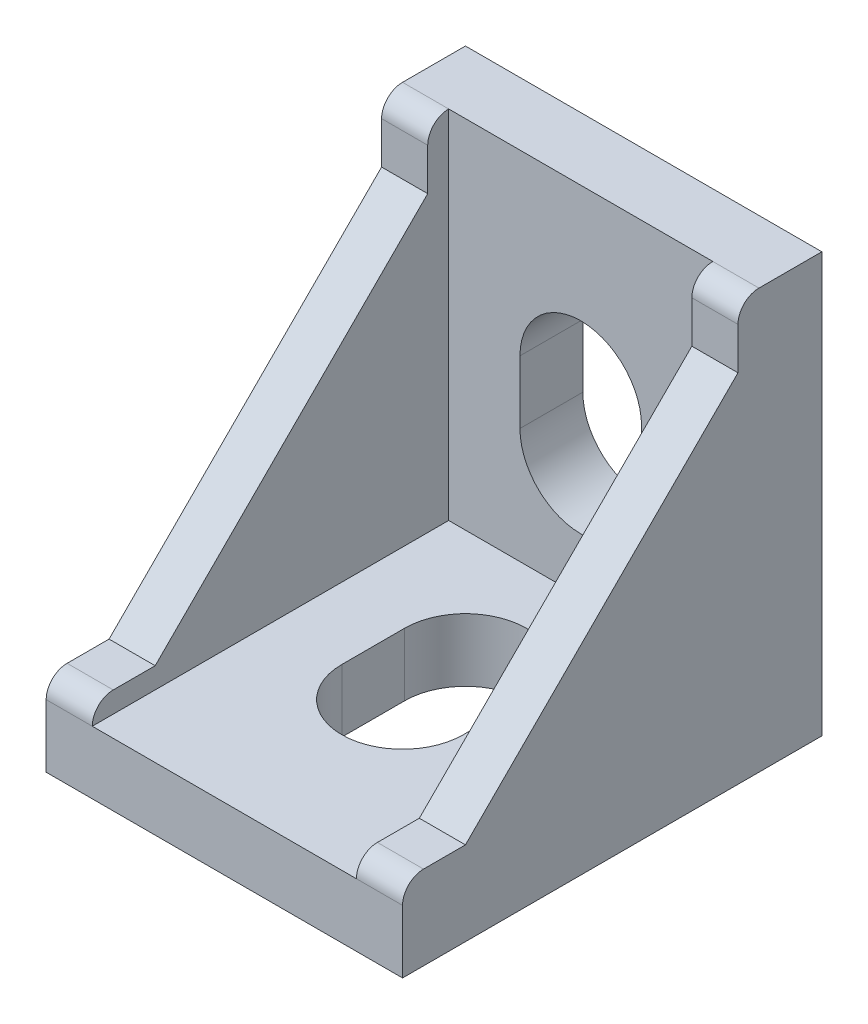
ISO-10303-21;
HEADER;
FILE_DESCRIPTION(('STEP AP214'),'2;1');
FILE_NAME('part.step','',(''),(''),'','','');
FILE_SCHEMA(('AUTOMOTIVE_DESIGN { 1 0 10303 214 1 1 1 1 }'));
ENDSEC;
DATA;
#1=APPLICATION_CONTEXT('core data for automotive mechanical design processes');
#2=APPLICATION_PROTOCOL_DEFINITION('international standard','automotive_design',2000,#1);
#3=PRODUCT_CONTEXT('',#1,'mechanical');
#4=PRODUCT('Part','Part','',(#3));
#5=PRODUCT_RELATED_PRODUCT_CATEGORY('part','',(#4));
#6=PRODUCT_DEFINITION_FORMATION('','',#4);
#7=PRODUCT_DEFINITION_CONTEXT('part definition',#1,'design');
#8=PRODUCT_DEFINITION('design','',#6,#7);
#9=PRODUCT_DEFINITION_SHAPE('','',#8);
#10=(LENGTH_UNIT() NAMED_UNIT(*) SI_UNIT(.MILLI.,.METRE.));
#11=(NAMED_UNIT(*) PLANE_ANGLE_UNIT() SI_UNIT($,.RADIAN.));
#12=(NAMED_UNIT(*) SI_UNIT($,.STERADIAN.) SOLID_ANGLE_UNIT());
#13=UNCERTAINTY_MEASURE_WITH_UNIT(LENGTH_MEASURE(1.E-05),#10,'distance_accuracy_value','');
#14=(GEOMETRIC_REPRESENTATION_CONTEXT(3) GLOBAL_UNCERTAINTY_ASSIGNED_CONTEXT((#13)) GLOBAL_UNIT_ASSIGNED_CONTEXT((#10,
#11,#12)) REPRESENTATION_CONTEXT('',''));
#15=CARTESIAN_POINT('',(0.,0.,0.));
#16=DIRECTION('',(0.,0.,1.));
#17=DIRECTION('',(1.,0.,0.));
#18=AXIS2_PLACEMENT_3D('',#15,#16,#17);
#19=CARTESIAN_POINT('',(0.,20.,0.));
#20=DIRECTION('',(0.,-1.,0.));
#21=DIRECTION('',(0.,0.,-1.));
#22=AXIS2_PLACEMENT_3D('',#19,#20,#21);
#23=PLANE('',#22);
#24=DIRECTION('',(1.,0.,0.));
#25=VECTOR('',#24,1.);
#26=CARTESIAN_POINT('',(-8.5,20.,-7.00000000000001));
#27=LINE('',#26,#25);
#28=CARTESIAN_POINT('',(6.3,20.,-7.00000000000001));
#29=VERTEX_POINT('',#28);
#30=CARTESIAN_POINT('',(8.5,20.,-7.00000000000001));
#31=VERTEX_POINT('',#30);
#32=EDGE_CURVE('E280',#29,#31,#27,.T.);
#33=ORIENTED_EDGE('',*,*,#32,.T.);
#34=DIRECTION('',(0.,0.,-1.));
#35=VECTOR('',#34,1.);
#36=CARTESIAN_POINT('',(8.5,20.,10.));
#37=LINE('',#36,#35);
#38=CARTESIAN_POINT('',(8.5,20.,-10.));
#39=VERTEX_POINT('',#38);
#40=EDGE_CURVE('E355',#31,#39,#37,.T.);
#41=ORIENTED_EDGE('',*,*,#40,.T.);
#42=DIRECTION('',(-1.,0.,0.));
#43=VECTOR('',#42,1.);
#44=CARTESIAN_POINT('',(-8.5,20.,-10.));
#45=LINE('',#44,#43);
#46=CARTESIAN_POINT('',(-8.5,20.,-10.));
#47=VERTEX_POINT('',#46);
#48=EDGE_CURVE('E357',#39,#47,#45,.T.);
#49=ORIENTED_EDGE('',*,*,#48,.T.);
#50=DIRECTION('',(0.,0.,1.));
#51=VECTOR('',#50,1.);
#52=CARTESIAN_POINT('',(-8.5,20.,10.));
#53=LINE('',#52,#51);
#54=CARTESIAN_POINT('',(-8.5,20.,-7.00000000000001));
#55=VERTEX_POINT('',#54);
#56=EDGE_CURVE('E360',#47,#55,#53,.T.);
#57=ORIENTED_EDGE('',*,*,#56,.T.);
#58=CARTESIAN_POINT('',(-6.3,20.,-7.00000000000001));
#59=VERTEX_POINT('',#58);
#60=EDGE_CURVE('E313',#55,#59,#27,.T.);
#61=ORIENTED_EDGE('',*,*,#60,.T.);
#62=DIRECTION('',(-1.,0.,0.));
#63=VECTOR('',#62,1.);
#64=CARTESIAN_POINT('',(6.3,20.,-7.));
#65=LINE('',#64,#63);
#66=EDGE_CURVE('E333',#29,#59,#65,.T.);
#67=ORIENTED_EDGE('',*,*,#66,.F.);
#68=EDGE_LOOP('',(#33,#41,#49,#57,#61,#67));
#69=FACE_BOUND('',#68,.T.);
#70=ADVANCED_FACE('F34',(#69),#23,.F.);
#71=CARTESIAN_POINT('',(8.5,20.,10.));
#72=DIRECTION('',(-1.,0.,0.));
#73=DIRECTION('',(0.,0.,1.));
#74=AXIS2_PLACEMENT_3D('',#71,#72,#73);
#75=PLANE('',#74);
#76=ORIENTED_EDGE('',*,*,#40,.F.);
#77=CARTESIAN_POINT('',(8.5,19.,-7.));
#78=DIRECTION('',(-1.,0.,0.));
#79=DIRECTION('',(0.,0.,-1.));
#80=AXIS2_PLACEMENT_3D('',#77,#78,#79);
#81=CIRCLE('',#80,1.);
#82=CARTESIAN_POINT('',(8.5,19.,-6.));
#83=VERTEX_POINT('',#82);
#84=EDGE_CURVE('E257',#83,#31,#81,.T.);
#85=ORIENTED_EDGE('',*,*,#84,.F.);
#86=DIRECTION('',(0.,1.,0.));
#87=VECTOR('',#86,1.);
#88=CARTESIAN_POINT('',(8.5,19.,-6.));
#89=LINE('',#88,#87);
#90=CARTESIAN_POINT('',(8.5,17.,-6.));
#91=VERTEX_POINT('',#90);
#92=EDGE_CURVE('E268',#91,#83,#89,.T.);
#93=ORIENTED_EDGE('',*,*,#92,.F.);
#94=DIRECTION('',(0.,0.707106781186548,-0.707106781186548));
#95=VECTOR('',#94,1.);
#96=CARTESIAN_POINT('',(8.5,4.,7.));
#97=LINE('',#96,#95);
#98=CARTESIAN_POINT('',(8.5,4.,7.));
#99=VERTEX_POINT('',#98);
#100=EDGE_CURVE('E288',#99,#91,#97,.T.);
#101=ORIENTED_EDGE('',*,*,#100,.F.);
#102=DIRECTION('',(0.,0.,-1.));
#103=VECTOR('',#102,1.);
#104=CARTESIAN_POINT('',(8.5,4.,8.99999999999999));
#105=LINE('',#104,#103);
#106=CARTESIAN_POINT('',(8.5,4.,8.99999999999999));
#107=VERTEX_POINT('',#106);
#108=EDGE_CURVE('E285',#107,#99,#105,.T.);
#109=ORIENTED_EDGE('',*,*,#108,.F.);
#110=CARTESIAN_POINT('',(8.5,3.,9.));
#111=DIRECTION('',(-1.,0.,0.));
#112=DIRECTION('',(0.,0.,1.));
#113=AXIS2_PLACEMENT_3D('',#110,#111,#112);
#114=CIRCLE('',#113,1.);
#115=CARTESIAN_POINT('',(8.5,2.99999999999999,10.));
#116=VERTEX_POINT('',#115);
#117=EDGE_CURVE('E282',#116,#107,#114,.T.);
#118=ORIENTED_EDGE('',*,*,#117,.F.);
#119=DIRECTION('',(0.,-1.,0.));
#120=VECTOR('',#119,1.);
#121=CARTESIAN_POINT('',(8.5,20.,10.));
#122=LINE('',#121,#120);
#123=CARTESIAN_POINT('',(8.5,0.,10.));
#124=VERTEX_POINT('',#123);
#125=EDGE_CURVE('E363',#116,#124,#122,.T.);
#126=ORIENTED_EDGE('',*,*,#125,.T.);
#127=DIRECTION('',(0.,0.,-1.));
#128=VECTOR('',#127,1.);
#129=CARTESIAN_POINT('',(8.5,0.,10.));
#130=LINE('',#129,#128);
#131=CARTESIAN_POINT('',(8.5,0.,-10.));
#132=VERTEX_POINT('',#131);
#133=EDGE_CURVE('E352',#124,#132,#130,.T.);
#134=ORIENTED_EDGE('',*,*,#133,.T.);
#135=DIRECTION('',(0.,-1.,0.));
#136=VECTOR('',#135,1.);
#137=CARTESIAN_POINT('',(8.5,20.,-10.));
#138=LINE('',#137,#136);
#139=EDGE_CURVE('E379',#39,#132,#138,.T.);
#140=ORIENTED_EDGE('',*,*,#139,.F.);
#141=EDGE_LOOP('',(#76,#85,#93,#101,#109,#118,#126,#134,#140));
#142=FACE_BOUND('',#141,.T.);
#143=ADVANCED_FACE('F36',(#142),#75,.F.);
#144=CARTESIAN_POINT('',(-8.5,20.,-10.));
#145=DIRECTION('',(0.,0.,1.));
#146=DIRECTION('',(1.,0.,0.));
#147=AXIS2_PLACEMENT_3D('',#144,#145,#146);
#148=PLANE('',#147);
#149=DIRECTION('',(0.,1.,0.));
#150=VECTOR('',#149,1.);
#151=CARTESIAN_POINT('',(2.9,11.5,-10.));
#152=LINE('',#151,#150);
#153=CARTESIAN_POINT('',(2.9,8.5,-10.));
#154=VERTEX_POINT('',#153);
#155=CARTESIAN_POINT('',(2.9,11.5,-10.));
#156=VERTEX_POINT('',#155);
#157=EDGE_CURVE('E242',#154,#156,#152,.T.);
#158=ORIENTED_EDGE('',*,*,#157,.T.);
#159=CARTESIAN_POINT('',(0.,11.5,-10.));
#160=DIRECTION('',(0.,0.,1.));
#161=DIRECTION('',(1.,0.,0.));
#162=AXIS2_PLACEMENT_3D('',#159,#160,#161);
#163=CIRCLE('',#162,2.9);
#164=CARTESIAN_POINT('',(-2.9,11.5,-10.));
#165=VERTEX_POINT('',#164);
#166=EDGE_CURVE('E232',#156,#165,#163,.T.);
#167=ORIENTED_EDGE('',*,*,#166,.T.);
#168=DIRECTION('',(0.,-1.,0.));
#169=VECTOR('',#168,1.);
#170=CARTESIAN_POINT('',(-2.9,8.5,-10.));
#171=LINE('',#170,#169);
#172=CARTESIAN_POINT('',(-2.9,8.5,-10.));
#173=VERTEX_POINT('',#172);
#174=EDGE_CURVE('E235',#165,#173,#171,.T.);
#175=ORIENTED_EDGE('',*,*,#174,.T.);
#176=CARTESIAN_POINT('',(0.,8.5,-10.));
#177=DIRECTION('',(0.,0.,1.));
#178=DIRECTION('',(1.,0.,0.));
#179=AXIS2_PLACEMENT_3D('',#176,#177,#178);
#180=CIRCLE('',#179,2.9);
#181=EDGE_CURVE('E239',#173,#154,#180,.T.);
#182=ORIENTED_EDGE('',*,*,#181,.T.);
#183=EDGE_LOOP('',(#158,#167,#175,#182));
#184=FACE_BOUND('',#183,.T.);
#185=DIRECTION('',(-1.,0.,0.));
#186=VECTOR('',#185,1.);
#187=CARTESIAN_POINT('',(-8.5,0.,-10.));
#188=LINE('',#187,#186);
#189=CARTESIAN_POINT('',(-8.5,0.,-10.));
#190=VERTEX_POINT('',#189);
#191=EDGE_CURVE('E366',#132,#190,#188,.T.);
#192=ORIENTED_EDGE('',*,*,#191,.T.);
#193=DIRECTION('',(0.,-1.,0.));
#194=VECTOR('',#193,1.);
#195=CARTESIAN_POINT('',(-8.5,20.,-10.));
#196=LINE('',#195,#194);
#197=EDGE_CURVE('E376',#47,#190,#196,.T.);
#198=ORIENTED_EDGE('',*,*,#197,.F.);
#199=ORIENTED_EDGE('',*,*,#48,.F.);
#200=ORIENTED_EDGE('',*,*,#139,.T.);
#201=EDGE_LOOP('',(#192,#198,#199,#200));
#202=FACE_BOUND('',#201,.T.);
#203=ADVANCED_FACE('F448',(#184,#202),#148,.F.);
#204=CARTESIAN_POINT('',(-8.5,20.,10.));
#205=DIRECTION('',(1.,0.,0.));
#206=DIRECTION('',(0.,0.,-1.));
#207=AXIS2_PLACEMENT_3D('',#204,#205,#206);
#208=PLANE('',#207);
#209=DIRECTION('',(0.,1.,0.));
#210=VECTOR('',#209,1.);
#211=CARTESIAN_POINT('',(-8.5,19.,-6.));
#212=LINE('',#211,#210);
#213=CARTESIAN_POINT('',(-8.5,17.,-6.));
#214=VERTEX_POINT('',#213);
#215=CARTESIAN_POINT('',(-8.5,19.,-6.));
#216=VERTEX_POINT('',#215);
#217=EDGE_CURVE('E277',#214,#216,#212,.T.);
#218=ORIENTED_EDGE('',*,*,#217,.T.);
#219=CARTESIAN_POINT('',(-8.5,19.,-7.));
#220=DIRECTION('',(-1.,0.,0.));
#221=DIRECTION('',(0.,0.,-1.));
#222=AXIS2_PLACEMENT_3D('',#219,#220,#221);
#223=CIRCLE('',#222,1.);
#224=EDGE_CURVE('E264',#216,#55,#223,.T.);
#225=ORIENTED_EDGE('',*,*,#224,.T.);
#226=ORIENTED_EDGE('',*,*,#56,.F.);
#227=ORIENTED_EDGE('',*,*,#197,.T.);
#228=DIRECTION('',(0.,0.,1.));
#229=VECTOR('',#228,1.);
#230=CARTESIAN_POINT('',(-8.5,0.,10.));
#231=LINE('',#230,#229);
#232=CARTESIAN_POINT('',(-8.5,0.,10.));
#233=VERTEX_POINT('',#232);
#234=EDGE_CURVE('E368',#190,#233,#231,.T.);
#235=ORIENTED_EDGE('',*,*,#234,.T.);
#236=DIRECTION('',(0.,-1.,0.));
#237=VECTOR('',#236,1.);
#238=CARTESIAN_POINT('',(-8.5,20.,10.));
#239=LINE('',#238,#237);
#240=CARTESIAN_POINT('',(-8.5,2.99999999999999,10.));
#241=VERTEX_POINT('',#240);
#242=EDGE_CURVE('E374',#241,#233,#239,.T.);
#243=ORIENTED_EDGE('',*,*,#242,.F.);
#244=CARTESIAN_POINT('',(-8.5,3.,9.));
#245=DIRECTION('',(-1.,0.,0.));
#246=DIRECTION('',(0.,0.,1.));
#247=AXIS2_PLACEMENT_3D('',#244,#245,#246);
#248=CIRCLE('',#247,1.);
#249=CARTESIAN_POINT('',(-8.5,4.,8.99999999999999));
#250=VERTEX_POINT('',#249);
#251=EDGE_CURVE('E267',#241,#250,#248,.T.);
#252=ORIENTED_EDGE('',*,*,#251,.T.);
#253=DIRECTION('',(0.,0.,-1.));
#254=VECTOR('',#253,1.);
#255=CARTESIAN_POINT('',(-8.5,4.,8.99999999999999));
#256=LINE('',#255,#254);
#257=CARTESIAN_POINT('',(-8.5,4.,7.));
#258=VERTEX_POINT('',#257);
#259=EDGE_CURVE('E271',#250,#258,#256,.T.);
#260=ORIENTED_EDGE('',*,*,#259,.T.);
#261=DIRECTION('',(0.,0.707106781186548,-0.707106781186548));
#262=VECTOR('',#261,1.);
#263=CARTESIAN_POINT('',(-8.5,4.,7.));
#264=LINE('',#263,#262);
#265=EDGE_CURVE('E274',#258,#214,#264,.T.);
#266=ORIENTED_EDGE('',*,*,#265,.T.);
#267=EDGE_LOOP('',(#218,#225,#226,#227,#235,#243,#252,#260,#266));
#268=FACE_BOUND('',#267,.T.);
#269=ADVANCED_FACE('F457',(#268),#208,.F.);
#270=CARTESIAN_POINT('',(-8.5,20.,10.));
#271=DIRECTION('',(0.,0.,-1.));
#272=DIRECTION('',(-1.,0.,0.));
#273=AXIS2_PLACEMENT_3D('',#270,#271,#272);
#274=PLANE('',#273);
#275=ORIENTED_EDGE('',*,*,#125,.F.);
#276=DIRECTION('',(1.,0.,0.));
#277=VECTOR('',#276,1.);
#278=CARTESIAN_POINT('',(-8.5,2.99999999999999,10.));
#279=LINE('',#278,#277);
#280=CARTESIAN_POINT('',(6.3,2.99999999999999,10.));
#281=VERTEX_POINT('',#280);
#282=EDGE_CURVE('E312',#281,#116,#279,.T.);
#283=ORIENTED_EDGE('',*,*,#282,.F.);
#284=DIRECTION('',(1.,0.,0.));
#285=VECTOR('',#284,1.);
#286=CARTESIAN_POINT('',(-6.3,3.,10.));
#287=LINE('',#286,#285);
#288=CARTESIAN_POINT('',(-6.3,3.,10.));
#289=VERTEX_POINT('',#288);
#290=EDGE_CURVE('E337',#289,#281,#287,.T.);
#291=ORIENTED_EDGE('',*,*,#290,.F.);
#292=EDGE_CURVE('E310',#241,#289,#279,.T.);
#293=ORIENTED_EDGE('',*,*,#292,.F.);
#294=ORIENTED_EDGE('',*,*,#242,.T.);
#295=DIRECTION('',(1.,0.,0.));
#296=VECTOR('',#295,1.);
#297=CARTESIAN_POINT('',(-8.5,0.,10.));
#298=LINE('',#297,#296);
#299=EDGE_CURVE('E358',#233,#124,#298,.T.);
#300=ORIENTED_EDGE('',*,*,#299,.T.);
#301=EDGE_LOOP('',(#275,#283,#291,#293,#294,#300));
#302=FACE_BOUND('',#301,.T.);
#303=ADVANCED_FACE('F422',(#302),#274,.F.);
#304=CARTESIAN_POINT('',(0.,0.,0.));
#305=DIRECTION('',(0.,-1.,0.));
#306=DIRECTION('',(0.,0.,-1.));
#307=AXIS2_PLACEMENT_3D('',#304,#305,#306);
#308=PLANE('',#307);
#309=CARTESIAN_POINT('',(0.,0.,-1.5));
#310=DIRECTION('',(0.,1.,0.));
#311=DIRECTION('',(0.,0.,1.));
#312=AXIS2_PLACEMENT_3D('',#309,#310,#311);
#313=CIRCLE('',#312,2.9);
#314=CARTESIAN_POINT('',(2.9,0.,-1.5));
#315=VERTEX_POINT('',#314);
#316=CARTESIAN_POINT('',(-2.9,0.,-1.5));
#317=VERTEX_POINT('',#316);
#318=EDGE_CURVE('E197',#315,#317,#313,.T.);
#319=ORIENTED_EDGE('',*,*,#318,.T.);
#320=DIRECTION('',(0.,0.,1.));
#321=VECTOR('',#320,1.);
#322=CARTESIAN_POINT('',(-2.9,0.,1.5));
#323=LINE('',#322,#321);
#324=CARTESIAN_POINT('',(-2.9,0.,1.5));
#325=VERTEX_POINT('',#324);
#326=EDGE_CURVE('E206',#317,#325,#323,.T.);
#327=ORIENTED_EDGE('',*,*,#326,.T.);
#328=CARTESIAN_POINT('',(0.,0.,1.5));
#329=DIRECTION('',(0.,1.,0.));
#330=DIRECTION('',(0.,0.,1.));
#331=AXIS2_PLACEMENT_3D('',#328,#329,#330);
#332=CIRCLE('',#331,2.9);
#333=CARTESIAN_POINT('',(2.9,0.,1.5));
#334=VERTEX_POINT('',#333);
#335=EDGE_CURVE('E49',#325,#334,#332,.T.);
#336=ORIENTED_EDGE('',*,*,#335,.T.);
#337=DIRECTION('',(0.,0.,-1.));
#338=VECTOR('',#337,1.);
#339=CARTESIAN_POINT('',(2.9,0.,-1.5));
#340=LINE('',#339,#338);
#341=EDGE_CURVE('E203',#334,#315,#340,.T.);
#342=ORIENTED_EDGE('',*,*,#341,.T.);
#343=EDGE_LOOP('',(#319,#327,#336,#342));
#344=FACE_BOUND('',#343,.T.);
#345=ORIENTED_EDGE('',*,*,#133,.F.);
#346=ORIENTED_EDGE('',*,*,#299,.F.);
#347=ORIENTED_EDGE('',*,*,#234,.F.);
#348=ORIENTED_EDGE('',*,*,#191,.F.);
#349=EDGE_LOOP('',(#345,#346,#347,#348));
#350=FACE_BOUND('',#349,.T.);
#351=ADVANCED_FACE('F210',(#344,#350),#308,.T.);
#352=CARTESIAN_POINT('',(-6.3,3.,-7.));
#353=DIRECTION('',(-1.,0.,0.));
#354=DIRECTION('',(0.,0.,1.));
#355=AXIS2_PLACEMENT_3D('',#352,#353,#354);
#356=PLANE('',#355);
#357=DIRECTION('',(0.,1.,0.));
#358=VECTOR('',#357,1.);
#359=CARTESIAN_POINT('',(-6.3,3.,-7.));
#360=LINE('',#359,#358);
#361=CARTESIAN_POINT('',(-6.3,3.,-7.));
#362=VERTEX_POINT('',#361);
#363=EDGE_CURVE('E349',#362,#59,#360,.T.);
#364=ORIENTED_EDGE('',*,*,#363,.T.);
#365=CARTESIAN_POINT('',(-6.3,19.,-7.));
#366=DIRECTION('',(-1.,0.,0.));
#367=DIRECTION('',(0.,0.,1.));
#368=AXIS2_PLACEMENT_3D('',#365,#366,#367);
#369=CIRCLE('',#368,1.);
#370=CARTESIAN_POINT('',(-6.3,19.,-6.));
#371=VERTEX_POINT('',#370);
#372=EDGE_CURVE('E330',#59,#371,#369,.F.);
#373=ORIENTED_EDGE('',*,*,#372,.T.);
#374=DIRECTION('',(0.,-1.,0.));
#375=VECTOR('',#374,1.);
#376=CARTESIAN_POINT('',(-6.3,3.,-6.));
#377=LINE('',#376,#375);
#378=CARTESIAN_POINT('',(-6.3,17.,-6.));
#379=VERTEX_POINT('',#378);
#380=EDGE_CURVE('E327',#371,#379,#377,.T.);
#381=ORIENTED_EDGE('',*,*,#380,.T.);
#382=DIRECTION('',(0.,-0.707106781186548,0.707106781186548));
#383=VECTOR('',#382,1.);
#384=CARTESIAN_POINT('',(-6.3,10.5,0.5));
#385=LINE('',#384,#383);
#386=CARTESIAN_POINT('',(-6.3,4.,7.));
#387=VERTEX_POINT('',#386);
#388=EDGE_CURVE('E324',#379,#387,#385,.T.);
#389=ORIENTED_EDGE('',*,*,#388,.T.);
#390=DIRECTION('',(0.,0.,1.));
#391=VECTOR('',#390,1.);
#392=CARTESIAN_POINT('',(-6.3,4.,-7.));
#393=LINE('',#392,#391);
#394=CARTESIAN_POINT('',(-6.3,4.,8.99999999999999));
#395=VERTEX_POINT('',#394);
#396=EDGE_CURVE('E321',#387,#395,#393,.T.);
#397=ORIENTED_EDGE('',*,*,#396,.T.);
#398=CARTESIAN_POINT('',(-6.3,3.,9.));
#399=DIRECTION('',(-1.,0.,0.));
#400=DIRECTION('',(0.,0.,1.));
#401=AXIS2_PLACEMENT_3D('',#398,#399,#400);
#402=CIRCLE('',#401,1.);
#403=EDGE_CURVE('E318',#395,#289,#402,.F.);
#404=ORIENTED_EDGE('',*,*,#403,.T.);
#405=DIRECTION('',(0.,0.,1.));
#406=VECTOR('',#405,1.);
#407=CARTESIAN_POINT('',(-6.3,3.,-7.));
#408=LINE('',#407,#406);
#409=EDGE_CURVE('E334',#362,#289,#408,.T.);
#410=ORIENTED_EDGE('',*,*,#409,.F.);
#411=EDGE_LOOP('',(#364,#373,#381,#389,#397,#404,#410));
#412=FACE_BOUND('',#411,.T.);
#413=ADVANCED_FACE('F451',(#412),#356,.F.);
#414=CARTESIAN_POINT('',(6.3,3.,-7.));
#415=DIRECTION('',(0.,0.,-1.));
#416=DIRECTION('',(-1.,0.,0.));
#417=AXIS2_PLACEMENT_3D('',#414,#415,#416);
#418=PLANE('',#417);
#419=DIRECTION('',(0.,-1.,0.));
#420=VECTOR('',#419,1.);
#421=CARTESIAN_POINT('',(-2.9,8.5,-7.));
#422=LINE('',#421,#420);
#423=CARTESIAN_POINT('',(-2.9,11.5,-7.));
#424=VERTEX_POINT('',#423);
#425=CARTESIAN_POINT('',(-2.9,8.5,-7.));
#426=VERTEX_POINT('',#425);
#427=EDGE_CURVE('E247',#424,#426,#422,.T.);
#428=ORIENTED_EDGE('',*,*,#427,.F.);
#429=CARTESIAN_POINT('',(0.,11.5,-7.));
#430=DIRECTION('',(0.,0.,1.));
#431=DIRECTION('',(1.,0.,0.));
#432=AXIS2_PLACEMENT_3D('',#429,#430,#431);
#433=CIRCLE('',#432,2.9);
#434=CARTESIAN_POINT('',(2.9,11.5,-7.));
#435=VERTEX_POINT('',#434);
#436=EDGE_CURVE('E228',#435,#424,#433,.T.);
#437=ORIENTED_EDGE('',*,*,#436,.F.);
#438=DIRECTION('',(0.,1.,0.));
#439=VECTOR('',#438,1.);
#440=CARTESIAN_POINT('',(2.9,11.5,-7.));
#441=LINE('',#440,#439);
#442=CARTESIAN_POINT('',(2.9,8.5,-7.));
#443=VERTEX_POINT('',#442);
#444=EDGE_CURVE('E236',#443,#435,#441,.T.);
#445=ORIENTED_EDGE('',*,*,#444,.F.);
#446=CARTESIAN_POINT('',(0.,8.5,-7.));
#447=DIRECTION('',(0.,0.,1.));
#448=DIRECTION('',(1.,0.,0.));
#449=AXIS2_PLACEMENT_3D('',#446,#447,#448);
#450=CIRCLE('',#449,2.9);
#451=EDGE_CURVE('E250',#426,#443,#450,.T.);
#452=ORIENTED_EDGE('',*,*,#451,.F.);
#453=EDGE_LOOP('',(#428,#437,#445,#452));
#454=FACE_BOUND('',#453,.T.);
#455=ORIENTED_EDGE('',*,*,#66,.T.);
#456=ORIENTED_EDGE('',*,*,#363,.F.);
#457=DIRECTION('',(-1.,0.,0.));
#458=VECTOR('',#457,1.);
#459=CARTESIAN_POINT('',(6.3,3.,-7.));
#460=LINE('',#459,#458);
#461=CARTESIAN_POINT('',(6.3,3.,-7.));
#462=VERTEX_POINT('',#461);
#463=EDGE_CURVE('E343',#462,#362,#460,.T.);
#464=ORIENTED_EDGE('',*,*,#463,.F.);
#465=DIRECTION('',(0.,1.,0.));
#466=VECTOR('',#465,1.);
#467=CARTESIAN_POINT('',(6.3,3.,-7.));
#468=LINE('',#467,#466);
#469=EDGE_CURVE('E346',#462,#29,#468,.T.);
#470=ORIENTED_EDGE('',*,*,#469,.T.);
#471=EDGE_LOOP('',(#455,#456,#464,#470));
#472=FACE_BOUND('',#471,.T.);
#473=ADVANCED_FACE('F411',(#454,#472),#418,.F.);
#474=CARTESIAN_POINT('',(6.3,3.,10.));
#475=DIRECTION('',(1.,0.,0.));
#476=DIRECTION('',(0.,0.,-1.));
#477=AXIS2_PLACEMENT_3D('',#474,#475,#476);
#478=PLANE('',#477);
#479=DIRECTION('',(0.,1.,0.));
#480=VECTOR('',#479,1.);
#481=CARTESIAN_POINT('',(6.3,3.,-6.));
#482=LINE('',#481,#480);
#483=CARTESIAN_POINT('',(6.3,17.,-6.));
#484=VERTEX_POINT('',#483);
#485=CARTESIAN_POINT('',(6.3,19.,-6.));
#486=VERTEX_POINT('',#485);
#487=EDGE_CURVE('E42',#484,#486,#482,.T.);
#488=ORIENTED_EDGE('',*,*,#487,.T.);
#489=CARTESIAN_POINT('',(6.3,19.,-7.));
#490=DIRECTION('',(1.,0.,0.));
#491=DIRECTION('',(0.,0.,-1.));
#492=AXIS2_PLACEMENT_3D('',#489,#490,#491);
#493=CIRCLE('',#492,1.);
#494=EDGE_CURVE('E11',#486,#29,#493,.F.);
#495=ORIENTED_EDGE('',*,*,#494,.T.);
#496=ORIENTED_EDGE('',*,*,#469,.F.);
#497=DIRECTION('',(0.,0.,-1.));
#498=VECTOR('',#497,1.);
#499=CARTESIAN_POINT('',(6.3,3.,10.));
#500=LINE('',#499,#498);
#501=EDGE_CURVE('E340',#281,#462,#500,.T.);
#502=ORIENTED_EDGE('',*,*,#501,.F.);
#503=CARTESIAN_POINT('',(6.3,3.,9.));
#504=DIRECTION('',(1.,0.,0.));
#505=DIRECTION('',(0.,0.,-1.));
#506=AXIS2_PLACEMENT_3D('',#503,#504,#505);
#507=CIRCLE('',#506,1.);
#508=CARTESIAN_POINT('',(6.3,4.,8.99999999999999));
#509=VERTEX_POINT('',#508);
#510=EDGE_CURVE('E296',#281,#509,#507,.F.);
#511=ORIENTED_EDGE('',*,*,#510,.T.);
#512=DIRECTION('',(0.,0.,-1.));
#513=VECTOR('',#512,1.);
#514=CARTESIAN_POINT('',(6.3,4.,10.));
#515=LINE('',#514,#513);
#516=CARTESIAN_POINT('',(6.3,4.,7.));
#517=VERTEX_POINT('',#516);
#518=EDGE_CURVE('E382',#509,#517,#515,.T.);
#519=ORIENTED_EDGE('',*,*,#518,.T.);
#520=DIRECTION('',(0.,0.707106781186548,-0.707106781186548));
#521=VECTOR('',#520,1.);
#522=CARTESIAN_POINT('',(6.3,2.,9.));
#523=LINE('',#522,#521);
#524=EDGE_CURVE('E385',#517,#484,#523,.T.);
#525=ORIENTED_EDGE('',*,*,#524,.T.);
#526=EDGE_LOOP('',(#488,#495,#496,#502,#511,#519,#525));
#527=FACE_BOUND('',#526,.T.);
#528=ADVANCED_FACE('F389',(#527),#478,.F.);
#529=CARTESIAN_POINT('',(0.,3.,0.));
#530=DIRECTION('',(0.,1.,0.));
#531=DIRECTION('',(0.,0.,1.));
#532=AXIS2_PLACEMENT_3D('',#529,#530,#531);
#533=PLANE('',#532);
#534=CARTESIAN_POINT('',(0.,3.,-1.5));
#535=DIRECTION('',(0.,1.,0.));
#536=DIRECTION('',(0.,0.,1.));
#537=AXIS2_PLACEMENT_3D('',#534,#535,#536);
#538=CIRCLE('',#537,2.9);
#539=CARTESIAN_POINT('',(2.9,3.,-1.5));
#540=VERTEX_POINT('',#539);
#541=CARTESIAN_POINT('',(-2.9,3.,-1.5));
#542=VERTEX_POINT('',#541);
#543=EDGE_CURVE('E57',#540,#542,#538,.T.);
#544=ORIENTED_EDGE('',*,*,#543,.F.);
#545=DIRECTION('',(0.,0.,-1.));
#546=VECTOR('',#545,1.);
#547=CARTESIAN_POINT('',(2.9,3.,-1.5));
#548=LINE('',#547,#546);
#549=CARTESIAN_POINT('',(2.9,3.,1.5));
#550=VERTEX_POINT('',#549);
#551=EDGE_CURVE('E213',#550,#540,#548,.T.);
#552=ORIENTED_EDGE('',*,*,#551,.F.);
#553=CARTESIAN_POINT('',(0.,3.,1.5));
#554=DIRECTION('',(0.,1.,0.));
#555=DIRECTION('',(0.,0.,1.));
#556=AXIS2_PLACEMENT_3D('',#553,#554,#555);
#557=CIRCLE('',#556,2.9);
#558=CARTESIAN_POINT('',(-2.9,3.,1.5));
#559=VERTEX_POINT('',#558);
#560=EDGE_CURVE('E216',#559,#550,#557,.T.);
#561=ORIENTED_EDGE('',*,*,#560,.F.);
#562=DIRECTION('',(0.,0.,1.));
#563=VECTOR('',#562,1.);
#564=CARTESIAN_POINT('',(-2.9,3.,1.5));
#565=LINE('',#564,#563);
#566=EDGE_CURVE('E222',#542,#559,#565,.T.);
#567=ORIENTED_EDGE('',*,*,#566,.F.);
#568=EDGE_LOOP('',(#544,#552,#561,#567));
#569=FACE_BOUND('',#568,.T.);
#570=ORIENTED_EDGE('',*,*,#409,.T.);
#571=ORIENTED_EDGE('',*,*,#290,.T.);
#572=ORIENTED_EDGE('',*,*,#501,.T.);
#573=ORIENTED_EDGE('',*,*,#463,.T.);
#574=EDGE_LOOP('',(#570,#571,#572,#573));
#575=FACE_BOUND('',#574,.T.);
#576=ADVANCED_FACE('F416',(#569,#575),#533,.T.);
#577=CARTESIAN_POINT('',(-8.5,3.,9.));
#578=DIRECTION('',(1.,0.,0.));
#579=DIRECTION('',(0.,0.,-1.));
#580=AXIS2_PLACEMENT_3D('',#577,#578,#579);
#581=CYLINDRICAL_SURFACE('',#580,1.);
#582=ORIENTED_EDGE('',*,*,#282,.T.);
#583=ORIENTED_EDGE('',*,*,#117,.T.);
#584=DIRECTION('',(1.,0.,0.));
#585=VECTOR('',#584,1.);
#586=CARTESIAN_POINT('',(-8.5,4.,8.99999999999999));
#587=LINE('',#586,#585);
#588=EDGE_CURVE('E309',#509,#107,#587,.T.);
#589=ORIENTED_EDGE('',*,*,#588,.F.);
#590=ORIENTED_EDGE('',*,*,#510,.F.);
#591=EDGE_LOOP('',(#582,#583,#589,#590));
#592=FACE_BOUND('',#591,.T.);
#593=ADVANCED_FACE('F426',(#592),#581,.T.);
#594=CARTESIAN_POINT('',(-8.5,4.,8.99999999999999));
#595=DIRECTION('',(0.,-1.,0.));
#596=DIRECTION('',(0.,0.,-1.));
#597=AXIS2_PLACEMENT_3D('',#594,#595,#596);
#598=PLANE('',#597);
#599=ORIENTED_EDGE('',*,*,#588,.T.);
#600=ORIENTED_EDGE('',*,*,#108,.T.);
#601=DIRECTION('',(1.,0.,0.));
#602=VECTOR('',#601,1.);
#603=CARTESIAN_POINT('',(-8.5,4.,7.));
#604=LINE('',#603,#602);
#605=EDGE_CURVE('E305',#517,#99,#604,.T.);
#606=ORIENTED_EDGE('',*,*,#605,.F.);
#607=ORIENTED_EDGE('',*,*,#518,.F.);
#608=EDGE_LOOP('',(#599,#600,#606,#607));
#609=FACE_BOUND('',#608,.T.);
#610=ADVANCED_FACE('F428',(#609),#598,.F.);
#611=CARTESIAN_POINT('',(-8.5,4.,7.));
#612=DIRECTION('',(0.,-0.707106781186547,-0.707106781186547));
#613=DIRECTION('',(0.,0.707106781186548,-0.707106781186548));
#614=AXIS2_PLACEMENT_3D('',#611,#612,#613);
#615=PLANE('',#614);
#616=ORIENTED_EDGE('',*,*,#605,.T.);
#617=ORIENTED_EDGE('',*,*,#100,.T.);
#618=DIRECTION('',(1.,0.,0.));
#619=VECTOR('',#618,1.);
#620=CARTESIAN_POINT('',(-8.5,17.,-6.));
#621=LINE('',#620,#619);
#622=EDGE_CURVE('E301',#484,#91,#621,.T.);
#623=ORIENTED_EDGE('',*,*,#622,.F.);
#624=ORIENTED_EDGE('',*,*,#524,.F.);
#625=EDGE_LOOP('',(#616,#617,#623,#624));
#626=FACE_BOUND('',#625,.T.);
#627=ADVANCED_FACE('F395',(#626),#615,.F.);
#628=CARTESIAN_POINT('',(-8.5,19.,-6.));
#629=DIRECTION('',(0.,0.,-1.));
#630=DIRECTION('',(-1.,0.,0.));
#631=AXIS2_PLACEMENT_3D('',#628,#629,#630);
#632=PLANE('',#631);
#633=ORIENTED_EDGE('',*,*,#622,.T.);
#634=ORIENTED_EDGE('',*,*,#92,.T.);
#635=DIRECTION('',(1.,0.,0.));
#636=VECTOR('',#635,1.);
#637=CARTESIAN_POINT('',(-8.5,19.,-6.));
#638=LINE('',#637,#636);
#639=EDGE_CURVE('E297',#486,#83,#638,.T.);
#640=ORIENTED_EDGE('',*,*,#639,.F.);
#641=ORIENTED_EDGE('',*,*,#487,.F.);
#642=EDGE_LOOP('',(#633,#634,#640,#641));
#643=FACE_BOUND('',#642,.T.);
#644=ADVANCED_FACE('F393',(#643),#632,.F.);
#645=CARTESIAN_POINT('',(-8.5,19.,-7.));
#646=DIRECTION('',(1.,0.,0.));
#647=DIRECTION('',(0.,0.,-1.));
#648=AXIS2_PLACEMENT_3D('',#645,#646,#647);
#649=CYLINDRICAL_SURFACE('',#648,1.);
#650=ORIENTED_EDGE('',*,*,#639,.T.);
#651=ORIENTED_EDGE('',*,*,#84,.T.);
#652=ORIENTED_EDGE('',*,*,#32,.F.);
#653=ORIENTED_EDGE('',*,*,#494,.F.);
#654=EDGE_LOOP('',(#650,#651,#652,#653));
#655=FACE_BOUND('',#654,.T.);
#656=ADVANCED_FACE('F406',(#655),#649,.T.);
#657=ORIENTED_EDGE('',*,*,#60,.F.);
#658=ORIENTED_EDGE('',*,*,#224,.F.);
#659=EDGE_CURVE('E293',#216,#371,#638,.T.);
#660=ORIENTED_EDGE('',*,*,#659,.T.);
#661=ORIENTED_EDGE('',*,*,#372,.F.);
#662=EDGE_LOOP('',(#657,#658,#660,#661));
#663=FACE_BOUND('',#662,.T.);
#664=ADVANCED_FACE('F480',(#663),#649,.T.);
#665=ORIENTED_EDGE('',*,*,#659,.F.);
#666=ORIENTED_EDGE('',*,*,#217,.F.);
#667=EDGE_CURVE('E298',#214,#379,#621,.T.);
#668=ORIENTED_EDGE('',*,*,#667,.T.);
#669=ORIENTED_EDGE('',*,*,#380,.F.);
#670=EDGE_LOOP('',(#665,#666,#668,#669));
#671=FACE_BOUND('',#670,.T.);
#672=ADVANCED_FACE('F478',(#671),#632,.F.);
#673=ORIENTED_EDGE('',*,*,#667,.F.);
#674=ORIENTED_EDGE('',*,*,#265,.F.);
#675=EDGE_CURVE('E302',#258,#387,#604,.T.);
#676=ORIENTED_EDGE('',*,*,#675,.T.);
#677=ORIENTED_EDGE('',*,*,#388,.F.);
#678=EDGE_LOOP('',(#673,#674,#676,#677));
#679=FACE_BOUND('',#678,.T.);
#680=ADVANCED_FACE('F438',(#679),#615,.F.);
#681=ORIENTED_EDGE('',*,*,#675,.F.);
#682=ORIENTED_EDGE('',*,*,#259,.F.);
#683=EDGE_CURVE('E306',#250,#395,#587,.T.);
#684=ORIENTED_EDGE('',*,*,#683,.T.);
#685=ORIENTED_EDGE('',*,*,#396,.F.);
#686=EDGE_LOOP('',(#681,#682,#684,#685));
#687=FACE_BOUND('',#686,.T.);
#688=ADVANCED_FACE('F432',(#687),#598,.F.);
#689=ORIENTED_EDGE('',*,*,#683,.F.);
#690=ORIENTED_EDGE('',*,*,#251,.F.);
#691=ORIENTED_EDGE('',*,*,#292,.T.);
#692=ORIENTED_EDGE('',*,*,#403,.F.);
#693=EDGE_LOOP('',(#689,#690,#691,#692));
#694=FACE_BOUND('',#693,.T.);
#695=ADVANCED_FACE('F440',(#694),#581,.T.);
#696=CARTESIAN_POINT('',(0.,11.5,-10.));
#697=DIRECTION('',(0.,0.,1.));
#698=DIRECTION('',(1.,0.,0.));
#699=AXIS2_PLACEMENT_3D('',#696,#697,#698);
#700=CYLINDRICAL_SURFACE('',#699,2.9);
#701=ORIENTED_EDGE('',*,*,#436,.T.);
#702=DIRECTION('',(0.,0.,1.));
#703=VECTOR('',#702,1.);
#704=CARTESIAN_POINT('',(-2.9,11.5,-10.));
#705=LINE('',#704,#703);
#706=EDGE_CURVE('E245',#165,#424,#705,.T.);
#707=ORIENTED_EDGE('',*,*,#706,.F.);
#708=ORIENTED_EDGE('',*,*,#166,.F.);
#709=DIRECTION('',(0.,0.,1.));
#710=VECTOR('',#709,1.);
#711=CARTESIAN_POINT('',(2.9,11.5,-10.));
#712=LINE('',#711,#710);
#713=EDGE_CURVE('E255',#156,#435,#712,.T.);
#714=ORIENTED_EDGE('',*,*,#713,.T.);
#715=EDGE_LOOP('',(#701,#707,#708,#714));
#716=FACE_BOUND('',#715,.T.);
#717=ADVANCED_FACE('F498',(#716),#700,.F.);
#718=CARTESIAN_POINT('',(2.9,11.5,-10.));
#719=DIRECTION('',(1.,0.,0.));
#720=DIRECTION('',(0.,0.,-1.));
#721=AXIS2_PLACEMENT_3D('',#718,#719,#720);
#722=PLANE('',#721);
#723=ORIENTED_EDGE('',*,*,#444,.T.);
#724=ORIENTED_EDGE('',*,*,#713,.F.);
#725=ORIENTED_EDGE('',*,*,#157,.F.);
#726=DIRECTION('',(0.,0.,1.));
#727=VECTOR('',#726,1.);
#728=CARTESIAN_POINT('',(2.9,8.5,-10.));
#729=LINE('',#728,#727);
#730=EDGE_CURVE('E258',#154,#443,#729,.T.);
#731=ORIENTED_EDGE('',*,*,#730,.T.);
#732=EDGE_LOOP('',(#723,#724,#725,#731));
#733=FACE_BOUND('',#732,.T.);
#734=ADVANCED_FACE('F502',(#733),#722,.F.);
#735=CARTESIAN_POINT('',(0.,8.5,-10.));
#736=DIRECTION('',(0.,0.,1.));
#737=DIRECTION('',(1.,0.,0.));
#738=AXIS2_PLACEMENT_3D('',#735,#736,#737);
#739=CYLINDRICAL_SURFACE('',#738,2.9);
#740=ORIENTED_EDGE('',*,*,#451,.T.);
#741=ORIENTED_EDGE('',*,*,#730,.F.);
#742=ORIENTED_EDGE('',*,*,#181,.F.);
#743=DIRECTION('',(0.,0.,1.));
#744=VECTOR('',#743,1.);
#745=CARTESIAN_POINT('',(-2.9,8.5,-10.));
#746=LINE('',#745,#744);
#747=EDGE_CURVE('E260',#173,#426,#746,.T.);
#748=ORIENTED_EDGE('',*,*,#747,.T.);
#749=EDGE_LOOP('',(#740,#741,#742,#748));
#750=FACE_BOUND('',#749,.T.);
#751=ADVANCED_FACE('F508',(#750),#739,.F.);
#752=CARTESIAN_POINT('',(-2.9,8.5,-10.));
#753=DIRECTION('',(-1.,0.,0.));
#754=DIRECTION('',(0.,0.,1.));
#755=AXIS2_PLACEMENT_3D('',#752,#753,#754);
#756=PLANE('',#755);
#757=ORIENTED_EDGE('',*,*,#427,.T.);
#758=ORIENTED_EDGE('',*,*,#747,.F.);
#759=ORIENTED_EDGE('',*,*,#174,.F.);
#760=ORIENTED_EDGE('',*,*,#706,.T.);
#761=EDGE_LOOP('',(#757,#758,#759,#760));
#762=FACE_BOUND('',#761,.T.);
#763=ADVANCED_FACE('F513',(#762),#756,.F.);
#764=CARTESIAN_POINT('',(0.,0.,-1.5));
#765=DIRECTION('',(0.,1.,0.));
#766=DIRECTION('',(0.,0.,1.));
#767=AXIS2_PLACEMENT_3D('',#764,#765,#766);
#768=CYLINDRICAL_SURFACE('',#767,2.9);
#769=ORIENTED_EDGE('',*,*,#543,.T.);
#770=DIRECTION('',(0.,1.,0.));
#771=VECTOR('',#770,1.);
#772=CARTESIAN_POINT('',(-2.9,0.,-1.5));
#773=LINE('',#772,#771);
#774=EDGE_CURVE('E193',#317,#542,#773,.T.);
#775=ORIENTED_EDGE('',*,*,#774,.F.);
#776=ORIENTED_EDGE('',*,*,#318,.F.);
#777=DIRECTION('',(0.,1.,0.));
#778=VECTOR('',#777,1.);
#779=CARTESIAN_POINT('',(2.9,0.,-1.5));
#780=LINE('',#779,#778);
#781=EDGE_CURVE('E226',#315,#540,#780,.T.);
#782=ORIENTED_EDGE('',*,*,#781,.T.);
#783=EDGE_LOOP('',(#769,#775,#776,#782));
#784=FACE_BOUND('',#783,.T.);
#785=ADVANCED_FACE('F195',(#784),#768,.F.);
#786=CARTESIAN_POINT('',(2.9,0.,-1.5));
#787=DIRECTION('',(1.,0.,0.));
#788=DIRECTION('',(0.,0.,-1.));
#789=AXIS2_PLACEMENT_3D('',#786,#787,#788);
#790=PLANE('',#789);
#791=ORIENTED_EDGE('',*,*,#551,.T.);
#792=ORIENTED_EDGE('',*,*,#781,.F.);
#793=ORIENTED_EDGE('',*,*,#341,.F.);
#794=DIRECTION('',(0.,1.,0.));
#795=VECTOR('',#794,1.);
#796=CARTESIAN_POINT('',(2.9,0.,1.5));
#797=LINE('',#796,#795);
#798=EDGE_CURVE('E229',#334,#550,#797,.T.);
#799=ORIENTED_EDGE('',*,*,#798,.T.);
#800=EDGE_LOOP('',(#791,#792,#793,#799));
#801=FACE_BOUND('',#800,.T.);
#802=ADVANCED_FACE('F590',(#801),#790,.F.);
#803=CARTESIAN_POINT('',(0.,0.,1.5));
#804=DIRECTION('',(0.,1.,0.));
#805=DIRECTION('',(0.,0.,1.));
#806=AXIS2_PLACEMENT_3D('',#803,#804,#805);
#807=CYLINDRICAL_SURFACE('',#806,2.9);
#808=ORIENTED_EDGE('',*,*,#560,.T.);
#809=ORIENTED_EDGE('',*,*,#798,.F.);
#810=ORIENTED_EDGE('',*,*,#335,.F.);
#811=DIRECTION('',(0.,1.,0.));
#812=VECTOR('',#811,1.);
#813=CARTESIAN_POINT('',(-2.9,0.,1.5));
#814=LINE('',#813,#812);
#815=EDGE_CURVE('E202',#325,#559,#814,.T.);
#816=ORIENTED_EDGE('',*,*,#815,.T.);
#817=EDGE_LOOP('',(#808,#809,#810,#816));
#818=FACE_BOUND('',#817,.T.);
#819=ADVANCED_FACE('F599',(#818),#807,.F.);
#820=CARTESIAN_POINT('',(-2.9,0.,1.5));
#821=DIRECTION('',(-1.,0.,0.));
#822=DIRECTION('',(0.,0.,1.));
#823=AXIS2_PLACEMENT_3D('',#820,#821,#822);
#824=PLANE('',#823);
#825=ORIENTED_EDGE('',*,*,#566,.T.);
#826=ORIENTED_EDGE('',*,*,#815,.F.);
#827=ORIENTED_EDGE('',*,*,#326,.F.);
#828=ORIENTED_EDGE('',*,*,#774,.T.);
#829=EDGE_LOOP('',(#825,#826,#827,#828));
#830=FACE_BOUND('',#829,.T.);
#831=ADVANCED_FACE('F207',(#830),#824,.F.);
#832=CLOSED_SHELL('',(#70,#143,#203,#269,#303,#351,#413,#473,#528,#576,#593,#610,#627,#644,#656,
#664,#672,#680,#688,#695,#717,#734,#751,#763,#785,#802,#819,#831));
#833=MANIFOLD_SOLID_BREP('B2',#832);
#834=ADVANCED_BREP_SHAPE_REPRESENTATION('',(#18,#833),#14);
#835=SHAPE_DEFINITION_REPRESENTATION(#9,#834);
ENDSEC;
END-ISO-10303-21;
